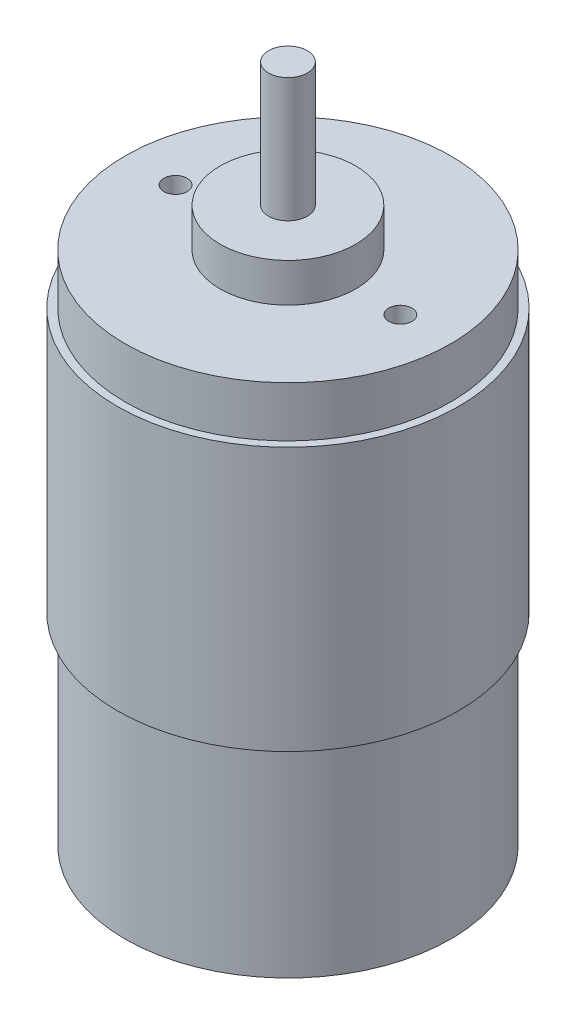
ISO-10303-21;
HEADER;
FILE_DESCRIPTION(('STEP AP214'),'2;1');
FILE_NAME('part.step','',(''),(''),'','','');
FILE_SCHEMA(('AUTOMOTIVE_DESIGN { 1 0 10303 214 1 1 1 1 }'));
ENDSEC;
DATA;
#1=APPLICATION_CONTEXT('core data for automotive mechanical design processes');
#2=APPLICATION_PROTOCOL_DEFINITION('international standard','automotive_design',2000,#1);
#3=PRODUCT_CONTEXT('',#1,'mechanical');
#4=PRODUCT('Part','Part','',(#3));
#5=PRODUCT_RELATED_PRODUCT_CATEGORY('part','',(#4));
#6=PRODUCT_DEFINITION_FORMATION('','',#4);
#7=PRODUCT_DEFINITION_CONTEXT('part definition',#1,'design');
#8=PRODUCT_DEFINITION('design','',#6,#7);
#9=PRODUCT_DEFINITION_SHAPE('','',#8);
#10=(LENGTH_UNIT() NAMED_UNIT(*) SI_UNIT(.MILLI.,.METRE.));
#11=(NAMED_UNIT(*) PLANE_ANGLE_UNIT() SI_UNIT($,.RADIAN.));
#12=(NAMED_UNIT(*) SI_UNIT($,.STERADIAN.) SOLID_ANGLE_UNIT());
#13=UNCERTAINTY_MEASURE_WITH_UNIT(LENGTH_MEASURE(1.E-05),#10,'distance_accuracy_value','');
#14=(GEOMETRIC_REPRESENTATION_CONTEXT(3) GLOBAL_UNCERTAINTY_ASSIGNED_CONTEXT((#13)) GLOBAL_UNIT_ASSIGNED_CONTEXT((#10,
#11,#12)) REPRESENTATION_CONTEXT('',''));
#15=CARTESIAN_POINT('',(0.,0.,0.));
#16=DIRECTION('',(0.,0.,1.));
#17=DIRECTION('',(1.,0.,0.));
#18=AXIS2_PLACEMENT_3D('',#15,#16,#17);
#19=CARTESIAN_POINT('',(0.,98.,0.));
#20=DIRECTION('',(0.,-1.,0.));
#21=DIRECTION('',(0.,0.,-1.));
#22=AXIS2_PLACEMENT_3D('',#19,#20,#21);
#23=PLANE('',#22);
#24=CARTESIAN_POINT('',(0.,98.,0.));
#25=DIRECTION('',(0.,1.,0.));
#26=DIRECTION('',(0.,0.,1.));
#27=AXIS2_PLACEMENT_3D('',#24,#25,#26);
#28=CIRCLE('',#27,2.5);
#29=CARTESIAN_POINT('',(0.,98.,2.5));
#30=VERTEX_POINT('',#29);
#31=EDGE_CURVE('E10',#30,#30,#28,.T.);
#32=ORIENTED_EDGE('',*,*,#31,.T.);
#33=EDGE_LOOP('',(#32));
#34=FACE_BOUND('',#33,.T.);
#35=ADVANCED_FACE('F36',(#34),#23,.F.);
#36=CARTESIAN_POINT('',(0.,120.576266676499,0.));
#37=DIRECTION('',(0.,1.,0.));
#38=DIRECTION('',(0.,0.,1.));
#39=AXIS2_PLACEMENT_3D('',#36,#37,#38);
#40=CYLINDRICAL_SURFACE('',#39,2.5);
#41=ORIENTED_EDGE('',*,*,#31,.F.);
#42=EDGE_LOOP('',(#41));
#43=FACE_BOUND('',#42,.T.);
#44=CARTESIAN_POINT('',(0.,82.,0.));
#45=DIRECTION('',(0.,1.,0.));
#46=DIRECTION('',(0.,0.,1.));
#47=AXIS2_PLACEMENT_3D('',#44,#45,#46);
#48=CIRCLE('',#47,2.5);
#49=CARTESIAN_POINT('',(0.,82.,2.5));
#50=VERTEX_POINT('',#49);
#51=EDGE_CURVE('E42',#50,#50,#48,.T.);
#52=ORIENTED_EDGE('',*,*,#51,.T.);
#53=EDGE_LOOP('',(#52));
#54=FACE_BOUND('',#53,.T.);
#55=ADVANCED_FACE('F182',(#43,#54),#40,.T.);
#56=CARTESIAN_POINT('',(2.5,82.,0.));
#57=DIRECTION('',(0.,-1.,0.));
#58=DIRECTION('',(0.,0.,-1.));
#59=AXIS2_PLACEMENT_3D('',#56,#57,#58);
#60=PLANE('',#59);
#61=ORIENTED_EDGE('',*,*,#51,.F.);
#62=EDGE_LOOP('',(#61));
#63=FACE_BOUND('',#62,.T.);
#64=CARTESIAN_POINT('',(0.,82.,0.));
#65=DIRECTION('',(0.,1.,0.));
#66=DIRECTION('',(0.,0.,1.));
#67=AXIS2_PLACEMENT_3D('',#64,#65,#66);
#68=CIRCLE('',#67,8.75000000000001);
#69=CARTESIAN_POINT('',(0.,82.,8.75000000000001));
#70=VERTEX_POINT('',#69);
#71=EDGE_CURVE('E46',#70,#70,#68,.T.);
#72=ORIENTED_EDGE('',*,*,#71,.T.);
#73=EDGE_LOOP('',(#72));
#74=FACE_BOUND('',#73,.T.);
#75=ADVANCED_FACE('F186',(#63,#74),#60,.F.);
#76=CARTESIAN_POINT('',(0.,120.576266676499,0.));
#77=DIRECTION('',(0.,1.,0.));
#78=DIRECTION('',(0.,0.,1.));
#79=AXIS2_PLACEMENT_3D('',#76,#77,#78);
#80=CYLINDRICAL_SURFACE('',#79,8.75000000000001);
#81=ORIENTED_EDGE('',*,*,#71,.F.);
#82=EDGE_LOOP('',(#81));
#83=FACE_BOUND('',#82,.T.);
#84=CARTESIAN_POINT('',(0.,77.,0.));
#85=DIRECTION('',(0.,1.,0.));
#86=DIRECTION('',(0.,0.,1.));
#87=AXIS2_PLACEMENT_3D('',#84,#85,#86);
#88=CIRCLE('',#87,8.75000000000001);
#89=CARTESIAN_POINT('',(0.,77.,8.75000000000001));
#90=VERTEX_POINT('',#89);
#91=EDGE_CURVE('E50',#90,#90,#88,.T.);
#92=ORIENTED_EDGE('',*,*,#91,.T.);
#93=EDGE_LOOP('',(#92));
#94=FACE_BOUND('',#93,.T.);
#95=ADVANCED_FACE('F111',(#83,#94),#80,.T.);
#96=CARTESIAN_POINT('',(8.75000000000001,77.,0.));
#97=DIRECTION('',(0.,-1.,0.));
#98=DIRECTION('',(0.,0.,-1.));
#99=AXIS2_PLACEMENT_3D('',#96,#97,#98);
#100=PLANE('',#99);
#101=CARTESIAN_POINT('',(14.5,77.,0.));
#102=DIRECTION('',(0.,1.,0.));
#103=DIRECTION('',(0.,0.,1.));
#104=AXIS2_PLACEMENT_3D('',#101,#102,#103);
#105=CIRCLE('',#104,1.5);
#106=CARTESIAN_POINT('',(14.5,77.,1.5));
#107=VERTEX_POINT('',#106);
#108=EDGE_CURVE('E92',#107,#107,#105,.T.);
#109=ORIENTED_EDGE('',*,*,#108,.F.);
#110=EDGE_LOOP('',(#109));
#111=FACE_BOUND('',#110,.T.);
#112=CARTESIAN_POINT('',(-14.5,77.,0.));
#113=DIRECTION('',(0.,1.,0.));
#114=DIRECTION('',(0.,0.,-1.));
#115=AXIS2_PLACEMENT_3D('',#112,#113,#114);
#116=CIRCLE('',#115,1.5);
#117=CARTESIAN_POINT('',(-14.5,77.,-1.5));
#118=VERTEX_POINT('',#117);
#119=EDGE_CURVE('E86',#118,#118,#116,.T.);
#120=ORIENTED_EDGE('',*,*,#119,.F.);
#121=EDGE_LOOP('',(#120));
#122=FACE_BOUND('',#121,.T.);
#123=ORIENTED_EDGE('',*,*,#91,.F.);
#124=EDGE_LOOP('',(#123));
#125=FACE_BOUND('',#124,.T.);
#126=CARTESIAN_POINT('',(0.,77.,0.));
#127=DIRECTION('',(0.,1.,0.));
#128=DIRECTION('',(0.,0.,1.));
#129=AXIS2_PLACEMENT_3D('',#126,#127,#128);
#130=CIRCLE('',#129,21.);
#131=CARTESIAN_POINT('',(0.,77.,21.));
#132=VERTEX_POINT('',#131);
#133=EDGE_CURVE('E55',#132,#132,#130,.T.);
#134=ORIENTED_EDGE('',*,*,#133,.T.);
#135=EDGE_LOOP('',(#134));
#136=FACE_BOUND('',#135,.T.);
#137=ADVANCED_FACE('F107',(#111,#122,#125,#136),#100,.F.);
#138=CARTESIAN_POINT('',(0.,120.576266676499,0.));
#139=DIRECTION('',(0.,1.,0.));
#140=DIRECTION('',(0.,0.,1.));
#141=AXIS2_PLACEMENT_3D('',#138,#139,#140);
#142=CYLINDRICAL_SURFACE('',#141,21.);
#143=ORIENTED_EDGE('',*,*,#133,.F.);
#144=EDGE_LOOP('',(#143));
#145=FACE_BOUND('',#144,.T.);
#146=CARTESIAN_POINT('',(0.,70.5,0.));
#147=DIRECTION('',(0.,1.,0.));
#148=DIRECTION('',(0.,0.,1.));
#149=AXIS2_PLACEMENT_3D('',#146,#147,#148);
#150=CIRCLE('',#149,21.);
#151=CARTESIAN_POINT('',(0.,70.5,21.));
#152=VERTEX_POINT('',#151);
#153=EDGE_CURVE('E58',#152,#152,#150,.T.);
#154=ORIENTED_EDGE('',*,*,#153,.T.);
#155=EDGE_LOOP('',(#154));
#156=FACE_BOUND('',#155,.T.);
#157=ADVANCED_FACE('F110',(#145,#156),#142,.T.);
#158=CARTESIAN_POINT('',(21.,70.5,0.));
#159=DIRECTION('',(0.,-1.,0.));
#160=DIRECTION('',(0.,0.,-1.));
#161=AXIS2_PLACEMENT_3D('',#158,#159,#160);
#162=PLANE('',#161);
#163=ORIENTED_EDGE('',*,*,#153,.F.);
#164=EDGE_LOOP('',(#163));
#165=FACE_BOUND('',#164,.T.);
#166=CARTESIAN_POINT('',(0.,70.5,0.));
#167=DIRECTION('',(0.,1.,0.));
#168=DIRECTION('',(0.,0.,1.));
#169=AXIS2_PLACEMENT_3D('',#166,#167,#168);
#170=CIRCLE('',#169,22.);
#171=CARTESIAN_POINT('',(0.,70.5,22.));
#172=VERTEX_POINT('',#171);
#173=EDGE_CURVE('E61',#172,#172,#170,.T.);
#174=ORIENTED_EDGE('',*,*,#173,.T.);
#175=EDGE_LOOP('',(#174));
#176=FACE_BOUND('',#175,.T.);
#177=ADVANCED_FACE('F121',(#165,#176),#162,.F.);
#178=CARTESIAN_POINT('',(0.,120.576266676499,0.));
#179=DIRECTION('',(0.,1.,0.));
#180=DIRECTION('',(0.,0.,1.));
#181=AXIS2_PLACEMENT_3D('',#178,#179,#180);
#182=CYLINDRICAL_SURFACE('',#181,22.);
#183=ORIENTED_EDGE('',*,*,#173,.F.);
#184=EDGE_LOOP('',(#183));
#185=FACE_BOUND('',#184,.T.);
#186=CARTESIAN_POINT('',(0.,36.5,0.));
#187=DIRECTION('',(0.,1.,0.));
#188=DIRECTION('',(0.,0.,1.));
#189=AXIS2_PLACEMENT_3D('',#186,#187,#188);
#190=CIRCLE('',#189,22.);
#191=CARTESIAN_POINT('',(0.,36.5,22.));
#192=VERTEX_POINT('',#191);
#193=EDGE_CURVE('E64',#192,#192,#190,.T.);
#194=ORIENTED_EDGE('',*,*,#193,.T.);
#195=EDGE_LOOP('',(#194));
#196=FACE_BOUND('',#195,.T.);
#197=ADVANCED_FACE('F127',(#185,#196),#182,.T.);
#198=CARTESIAN_POINT('',(22.,36.5,0.));
#199=DIRECTION('',(0.,1.,0.));
#200=DIRECTION('',(0.,0.,1.));
#201=AXIS2_PLACEMENT_3D('',#198,#199,#200);
#202=PLANE('',#201);
#203=ORIENTED_EDGE('',*,*,#193,.F.);
#204=EDGE_LOOP('',(#203));
#205=FACE_BOUND('',#204,.T.);
#206=CARTESIAN_POINT('',(0.,36.5,0.));
#207=DIRECTION('',(0.,1.,0.));
#208=DIRECTION('',(0.,0.,1.));
#209=AXIS2_PLACEMENT_3D('',#206,#207,#208);
#210=CIRCLE('',#209,21.);
#211=CARTESIAN_POINT('',(0.,36.5,21.));
#212=VERTEX_POINT('',#211);
#213=EDGE_CURVE('E67',#212,#212,#210,.T.);
#214=ORIENTED_EDGE('',*,*,#213,.T.);
#215=EDGE_LOOP('',(#214));
#216=FACE_BOUND('',#215,.T.);
#217=ADVANCED_FACE('F133',(#205,#216),#202,.F.);
#218=CARTESIAN_POINT('',(0.,120.576266676499,0.));
#219=DIRECTION('',(0.,1.,0.));
#220=DIRECTION('',(0.,0.,1.));
#221=AXIS2_PLACEMENT_3D('',#218,#219,#220);
#222=CYLINDRICAL_SURFACE('',#221,21.);
#223=ORIENTED_EDGE('',*,*,#213,.F.);
#224=EDGE_LOOP('',(#223));
#225=FACE_BOUND('',#224,.T.);
#226=CARTESIAN_POINT('',(0.,10.5,0.));
#227=DIRECTION('',(0.,1.,0.));
#228=DIRECTION('',(0.,0.,1.));
#229=AXIS2_PLACEMENT_3D('',#226,#227,#228);
#230=CIRCLE('',#229,21.);
#231=CARTESIAN_POINT('',(0.,10.5,21.));
#232=VERTEX_POINT('',#231);
#233=EDGE_CURVE('E70',#232,#232,#230,.T.);
#234=ORIENTED_EDGE('',*,*,#233,.T.);
#235=EDGE_LOOP('',(#234));
#236=FACE_BOUND('',#235,.T.);
#237=ADVANCED_FACE('F139',(#225,#236),#222,.T.);
#238=CARTESIAN_POINT('',(21.,10.5,0.));
#239=DIRECTION('',(0.,1.,0.));
#240=DIRECTION('',(0.,0.,1.));
#241=AXIS2_PLACEMENT_3D('',#238,#239,#240);
#242=PLANE('',#241);
#243=ORIENTED_EDGE('',*,*,#233,.F.);
#244=EDGE_LOOP('',(#243));
#245=FACE_BOUND('',#244,.T.);
#246=CARTESIAN_POINT('',(0.,10.5,0.));
#247=DIRECTION('',(0.,1.,0.));
#248=DIRECTION('',(0.,0.,1.));
#249=AXIS2_PLACEMENT_3D('',#246,#247,#248);
#250=CIRCLE('',#249,7.50000000000001);
#251=CARTESIAN_POINT('',(0.,10.5,7.50000000000001));
#252=VERTEX_POINT('',#251);
#253=EDGE_CURVE('E73',#252,#252,#250,.T.);
#254=ORIENTED_EDGE('',*,*,#253,.T.);
#255=EDGE_LOOP('',(#254));
#256=FACE_BOUND('',#255,.T.);
#257=ADVANCED_FACE('F145',(#245,#256),#242,.F.);
#258=CARTESIAN_POINT('',(0.,120.576266676499,0.));
#259=DIRECTION('',(0.,1.,0.));
#260=DIRECTION('',(0.,0.,1.));
#261=AXIS2_PLACEMENT_3D('',#258,#259,#260);
#262=CYLINDRICAL_SURFACE('',#261,7.50000000000001);
#263=ORIENTED_EDGE('',*,*,#253,.F.);
#264=EDGE_LOOP('',(#263));
#265=FACE_BOUND('',#264,.T.);
#266=CARTESIAN_POINT('',(0.,5.,0.));
#267=DIRECTION('',(0.,1.,0.));
#268=DIRECTION('',(0.,0.,1.));
#269=AXIS2_PLACEMENT_3D('',#266,#267,#268);
#270=CIRCLE('',#269,7.50000000000001);
#271=CARTESIAN_POINT('',(0.,5.,7.50000000000001));
#272=VERTEX_POINT('',#271);
#273=EDGE_CURVE('E76',#272,#272,#270,.T.);
#274=ORIENTED_EDGE('',*,*,#273,.T.);
#275=EDGE_LOOP('',(#274));
#276=FACE_BOUND('',#275,.T.);
#277=ADVANCED_FACE('F151',(#265,#276),#262,.T.);
#278=CARTESIAN_POINT('',(7.50000000000001,5.,0.));
#279=DIRECTION('',(0.,1.,0.));
#280=DIRECTION('',(0.,0.,1.));
#281=AXIS2_PLACEMENT_3D('',#278,#279,#280);
#282=PLANE('',#281);
#283=ORIENTED_EDGE('',*,*,#273,.F.);
#284=EDGE_LOOP('',(#283));
#285=FACE_BOUND('',#284,.T.);
#286=CARTESIAN_POINT('',(0.,5.,0.));
#287=DIRECTION('',(0.,1.,0.));
#288=DIRECTION('',(0.,0.,1.));
#289=AXIS2_PLACEMENT_3D('',#286,#287,#288);
#290=CIRCLE('',#289,5.);
#291=CARTESIAN_POINT('',(0.,5.,5.));
#292=VERTEX_POINT('',#291);
#293=EDGE_CURVE('E79',#292,#292,#290,.T.);
#294=ORIENTED_EDGE('',*,*,#293,.T.);
#295=EDGE_LOOP('',(#294));
#296=FACE_BOUND('',#295,.T.);
#297=ADVANCED_FACE('F157',(#285,#296),#282,.F.);
#298=CARTESIAN_POINT('',(0.,120.576266676499,0.));
#299=DIRECTION('',(0.,1.,0.));
#300=DIRECTION('',(0.,0.,1.));
#301=AXIS2_PLACEMENT_3D('',#298,#299,#300);
#302=CYLINDRICAL_SURFACE('',#301,5.);
#303=ORIENTED_EDGE('',*,*,#293,.F.);
#304=EDGE_LOOP('',(#303));
#305=FACE_BOUND('',#304,.T.);
#306=CARTESIAN_POINT('',(0.,0.,0.));
#307=DIRECTION('',(0.,1.,0.));
#308=DIRECTION('',(0.,0.,1.));
#309=AXIS2_PLACEMENT_3D('',#306,#307,#308);
#310=CIRCLE('',#309,5.);
#311=CARTESIAN_POINT('',(0.,0.,5.));
#312=VERTEX_POINT('',#311);
#313=EDGE_CURVE('E82',#312,#312,#310,.T.);
#314=ORIENTED_EDGE('',*,*,#313,.T.);
#315=EDGE_LOOP('',(#314));
#316=FACE_BOUND('',#315,.T.);
#317=ADVANCED_FACE('F163',(#305,#316),#302,.T.);
#318=CARTESIAN_POINT('',(5.,0.,0.));
#319=DIRECTION('',(0.,1.,0.));
#320=DIRECTION('',(0.,0.,1.));
#321=AXIS2_PLACEMENT_3D('',#318,#319,#320);
#322=PLANE('',#321);
#323=ORIENTED_EDGE('',*,*,#313,.F.);
#324=EDGE_LOOP('',(#323));
#325=FACE_BOUND('',#324,.T.);
#326=ADVANCED_FACE('F169',(#325),#322,.F.);
#327=CARTESIAN_POINT('',(-14.5,67.,0.));
#328=DIRECTION('',(0.,1.,0.));
#329=DIRECTION('',(0.,0.,1.));
#330=AXIS2_PLACEMENT_3D('',#327,#328,#329);
#331=CYLINDRICAL_SURFACE('',#330,1.5);
#332=CARTESIAN_POINT('',(-14.5,67.,0.));
#333=DIRECTION('',(0.,1.,0.));
#334=DIRECTION('',(0.,0.,-1.));
#335=AXIS2_PLACEMENT_3D('',#332,#333,#334);
#336=CIRCLE('',#335,1.5);
#337=CARTESIAN_POINT('',(-14.5,67.,-1.5));
#338=VERTEX_POINT('',#337);
#339=EDGE_CURVE('E89',#338,#338,#336,.T.);
#340=ORIENTED_EDGE('',*,*,#339,.F.);
#341=EDGE_LOOP('',(#340));
#342=FACE_BOUND('',#341,.T.);
#343=ORIENTED_EDGE('',*,*,#119,.T.);
#344=EDGE_LOOP('',(#343));
#345=FACE_BOUND('',#344,.T.);
#346=ADVANCED_FACE('F174',(#342,#345),#331,.F.);
#347=CARTESIAN_POINT('',(-14.5,67.,0.));
#348=DIRECTION('',(0.,-1.,0.));
#349=DIRECTION('',(0.,0.,-1.));
#350=AXIS2_PLACEMENT_3D('',#347,#348,#349);
#351=PLANE('',#350);
#352=ORIENTED_EDGE('',*,*,#339,.T.);
#353=EDGE_LOOP('',(#352));
#354=FACE_BOUND('',#353,.T.);
#355=ADVANCED_FACE('F103',(#354),#351,.F.);
#356=CARTESIAN_POINT('',(14.5,67.,0.));
#357=DIRECTION('',(0.,1.,0.));
#358=DIRECTION('',(0.,0.,1.));
#359=AXIS2_PLACEMENT_3D('',#356,#357,#358);
#360=CYLINDRICAL_SURFACE('',#359,1.5);
#361=CARTESIAN_POINT('',(14.5,67.,0.));
#362=DIRECTION('',(0.,1.,0.));
#363=DIRECTION('',(0.,0.,1.));
#364=AXIS2_PLACEMENT_3D('',#361,#362,#363);
#365=CIRCLE('',#364,1.5);
#366=CARTESIAN_POINT('',(14.5,67.,1.5));
#367=VERTEX_POINT('',#366);
#368=EDGE_CURVE('E85',#367,#367,#365,.T.);
#369=ORIENTED_EDGE('',*,*,#368,.F.);
#370=EDGE_LOOP('',(#369));
#371=FACE_BOUND('',#370,.T.);
#372=ORIENTED_EDGE('',*,*,#108,.T.);
#373=EDGE_LOOP('',(#372));
#374=FACE_BOUND('',#373,.T.);
#375=ADVANCED_FACE('F100',(#371,#374),#360,.F.);
#376=CARTESIAN_POINT('',(14.5,67.,0.));
#377=DIRECTION('',(0.,1.,0.));
#378=DIRECTION('',(0.,0.,1.));
#379=AXIS2_PLACEMENT_3D('',#376,#377,#378);
#380=PLANE('',#379);
#381=ORIENTED_EDGE('',*,*,#368,.T.);
#382=EDGE_LOOP('',(#381));
#383=FACE_BOUND('',#382,.T.);
#384=ADVANCED_FACE('F98',(#383),#380,.T.);
#385=CLOSED_SHELL('',(#35,#55,#75,#95,#137,#157,#177,#197,#217,#237,#257,#277,#297,#317,#326,
#346,#355,#375,#384));
#386=MANIFOLD_SOLID_BREP('B2',#385);
#387=ADVANCED_BREP_SHAPE_REPRESENTATION('',(#18,#386),#14);
#388=SHAPE_DEFINITION_REPRESENTATION(#9,#387);
ENDSEC;
END-ISO-10303-21;
